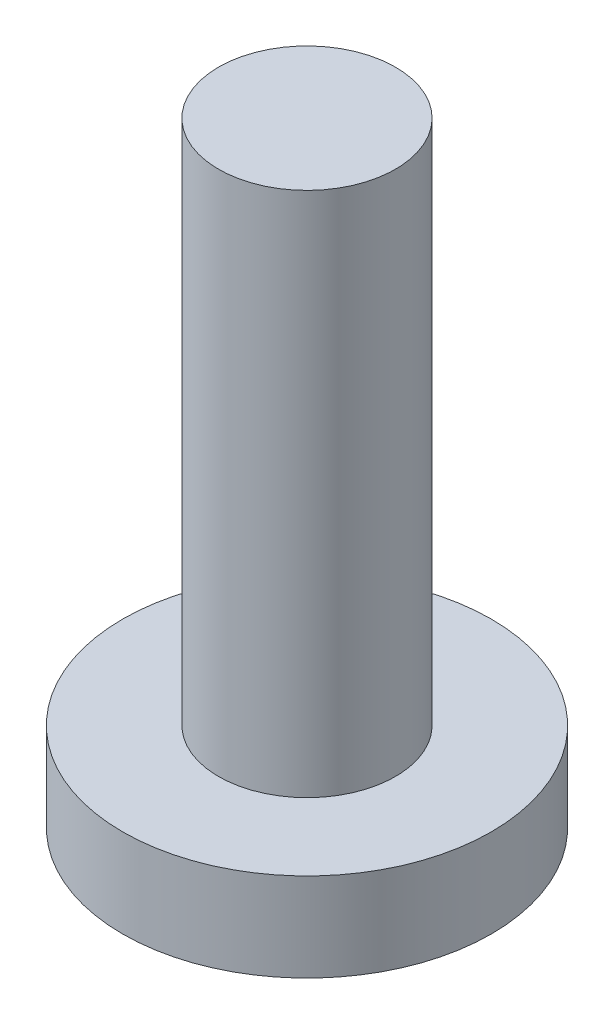
ISO-10303-21;
HEADER;
FILE_DESCRIPTION(('STEP AP214'),'2;1');
FILE_NAME('part.step','',(''),(''),'','','');
FILE_SCHEMA(('AUTOMOTIVE_DESIGN { 1 0 10303 214 1 1 1 1 }'));
ENDSEC;
DATA;
#1=APPLICATION_CONTEXT('core data for automotive mechanical design processes');
#2=APPLICATION_PROTOCOL_DEFINITION('international standard','automotive_design',2000,#1);
#3=PRODUCT_CONTEXT('',#1,'mechanical');
#4=PRODUCT('Part','Part','',(#3));
#5=PRODUCT_RELATED_PRODUCT_CATEGORY('part','',(#4));
#6=PRODUCT_DEFINITION_FORMATION('','',#4);
#7=PRODUCT_DEFINITION_CONTEXT('part definition',#1,'design');
#8=PRODUCT_DEFINITION('design','',#6,#7);
#9=PRODUCT_DEFINITION_SHAPE('','',#8);
#10=(LENGTH_UNIT() NAMED_UNIT(*) SI_UNIT(.MILLI.,.METRE.));
#11=(NAMED_UNIT(*) PLANE_ANGLE_UNIT() SI_UNIT($,.RADIAN.));
#12=(NAMED_UNIT(*) SI_UNIT($,.STERADIAN.) SOLID_ANGLE_UNIT());
#13=UNCERTAINTY_MEASURE_WITH_UNIT(LENGTH_MEASURE(1.E-05),#10,'distance_accuracy_value','');
#14=(GEOMETRIC_REPRESENTATION_CONTEXT(3) GLOBAL_UNCERTAINTY_ASSIGNED_CONTEXT((#13)) GLOBAL_UNIT_ASSIGNED_CONTEXT((#10,
#11,#12)) REPRESENTATION_CONTEXT('',''));
#15=CARTESIAN_POINT('',(0.,0.,0.));
#16=DIRECTION('',(0.,0.,1.));
#17=DIRECTION('',(1.,0.,0.));
#18=AXIS2_PLACEMENT_3D('',#15,#16,#17);
#19=CARTESIAN_POINT('',(1.143,0.,0.));
#20=DIRECTION('',(0.,-1.,0.));
#21=DIRECTION('',(1.,0.,0.));
#22=AXIS2_PLACEMENT_3D('',#19,#20,#21);
#23=PLANE('',#22);
#24=CARTESIAN_POINT('',(0.,0.,0.));
#25=DIRECTION('',(0.,1.,0.));
#26=DIRECTION('',(-1.,0.,0.));
#27=AXIS2_PLACEMENT_3D('',#24,#25,#26);
#28=CIRCLE('',#27,1.143);
#29=CARTESIAN_POINT('',(-1.143,0.,0.));
#30=VERTEX_POINT('',#29);
#31=EDGE_CURVE('E60',#30,#30,#28,.T.);
#32=ORIENTED_EDGE('',*,*,#31,.T.);
#33=EDGE_LOOP('',(#32));
#34=FACE_BOUND('',#33,.T.);
#35=ADVANCED_FACE('F43',(#34),#23,.F.);
#36=CARTESIAN_POINT('',(0.,-7.9375,0.));
#37=DIRECTION('',(0.,1.,0.));
#38=DIRECTION('',(-1.,0.,0.));
#39=AXIS2_PLACEMENT_3D('',#36,#37,#38);
#40=PLANE('',#39);
#41=CARTESIAN_POINT('',(0.,-7.9375,0.));
#42=DIRECTION('',(0.,1.,0.));
#43=DIRECTION('',(-1.,0.,0.));
#44=AXIS2_PLACEMENT_3D('',#41,#42,#43);
#45=CIRCLE('',#44,2.38125);
#46=CARTESIAN_POINT('',(-2.38125,-7.9375,0.));
#47=VERTEX_POINT('',#46);
#48=EDGE_CURVE('E10',#47,#47,#45,.T.);
#49=ORIENTED_EDGE('',*,*,#48,.F.);
#50=EDGE_LOOP('',(#49));
#51=FACE_BOUND('',#50,.T.);
#52=ADVANCED_FACE('F81',(#51),#40,.F.);
#53=CARTESIAN_POINT('',(0.,0.,0.));
#54=DIRECTION('',(0.,1.,0.));
#55=DIRECTION('',(-1.,0.,0.));
#56=AXIS2_PLACEMENT_3D('',#53,#54,#55);
#57=CYLINDRICAL_SURFACE('',#56,2.38125);
#58=CARTESIAN_POINT('',(0.,-6.7945,0.));
#59=DIRECTION('',(0.,1.,0.));
#60=DIRECTION('',(-1.,0.,0.));
#61=AXIS2_PLACEMENT_3D('',#58,#59,#60);
#62=CIRCLE('',#61,2.38125);
#63=CARTESIAN_POINT('',(-2.38125,-6.7945,0.));
#64=VERTEX_POINT('',#63);
#65=EDGE_CURVE('E50',#64,#64,#62,.T.);
#66=ORIENTED_EDGE('',*,*,#65,.F.);
#67=EDGE_LOOP('',(#66));
#68=FACE_BOUND('',#67,.T.);
#69=ORIENTED_EDGE('',*,*,#48,.T.);
#70=EDGE_LOOP('',(#69));
#71=FACE_BOUND('',#70,.T.);
#72=ADVANCED_FACE('F76',(#68,#71),#57,.T.);
#73=CARTESIAN_POINT('',(2.38125,-6.7945,0.));
#74=DIRECTION('',(0.,-1.,0.));
#75=DIRECTION('',(1.,0.,0.));
#76=AXIS2_PLACEMENT_3D('',#73,#74,#75);
#77=PLANE('',#76);
#78=CARTESIAN_POINT('',(0.,-6.7945,0.));
#79=DIRECTION('',(0.,1.,0.));
#80=DIRECTION('',(-1.,0.,0.));
#81=AXIS2_PLACEMENT_3D('',#78,#79,#80);
#82=CIRCLE('',#81,1.143);
#83=CARTESIAN_POINT('',(-1.143,-6.7945,0.));
#84=VERTEX_POINT('',#83);
#85=EDGE_CURVE('E55',#84,#84,#82,.T.);
#86=ORIENTED_EDGE('',*,*,#85,.F.);
#87=EDGE_LOOP('',(#86));
#88=FACE_BOUND('',#87,.T.);
#89=ORIENTED_EDGE('',*,*,#65,.T.);
#90=EDGE_LOOP('',(#89));
#91=FACE_BOUND('',#90,.T.);
#92=ADVANCED_FACE('F71',(#88,#91),#77,.F.);
#93=CARTESIAN_POINT('',(0.,0.,0.));
#94=DIRECTION('',(0.,1.,0.));
#95=DIRECTION('',(-1.,0.,0.));
#96=AXIS2_PLACEMENT_3D('',#93,#94,#95);
#97=CYLINDRICAL_SURFACE('',#96,1.143);
#98=ORIENTED_EDGE('',*,*,#31,.F.);
#99=EDGE_LOOP('',(#98));
#100=FACE_BOUND('',#99,.T.);
#101=ORIENTED_EDGE('',*,*,#85,.T.);
#102=EDGE_LOOP('',(#101));
#103=FACE_BOUND('',#102,.T.);
#104=ADVANCED_FACE('F68',(#100,#103),#97,.T.);
#105=CLOSED_SHELL('',(#35,#52,#72,#92,#104));
#106=MANIFOLD_SOLID_BREP('B2',#105);
#107=ADVANCED_BREP_SHAPE_REPRESENTATION('',(#18,#106),#14);
#108=SHAPE_DEFINITION_REPRESENTATION(#9,#107);
ENDSEC;
END-ISO-10303-21;
